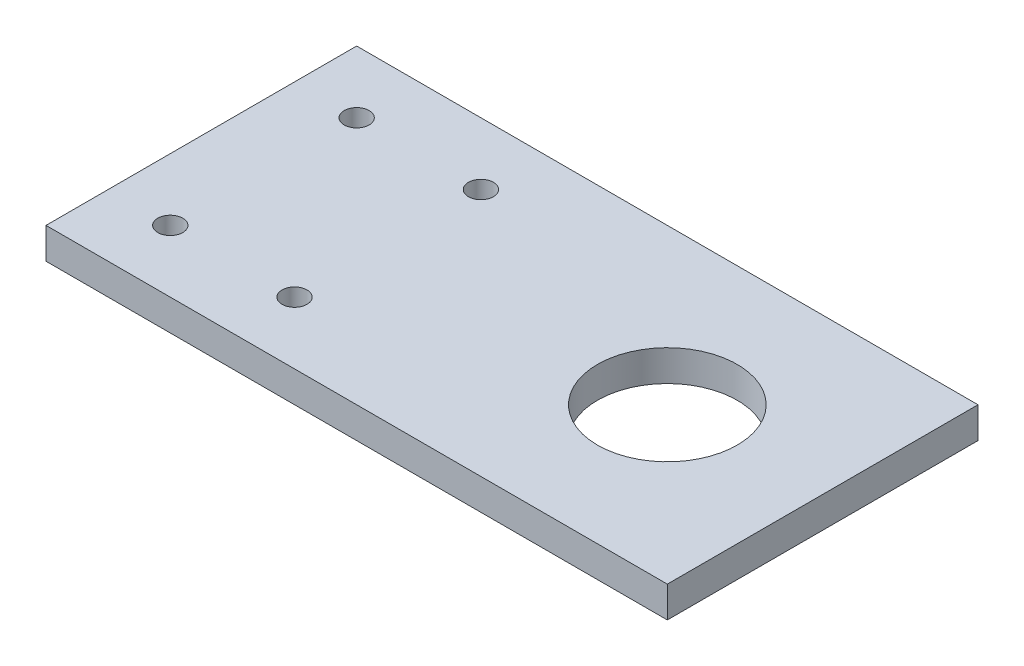
ISO-10303-21;
HEADER;
FILE_DESCRIPTION(('STEP AP214'),'2;1');
FILE_NAME('part.step','',(''),(''),'','','');
FILE_SCHEMA(('AUTOMOTIVE_DESIGN { 1 0 10303 214 1 1 1 1 }'));
ENDSEC;
DATA;
#1=APPLICATION_CONTEXT('core data for automotive mechanical design processes');
#2=APPLICATION_PROTOCOL_DEFINITION('international standard','automotive_design',2000,#1);
#3=PRODUCT_CONTEXT('',#1,'mechanical');
#4=PRODUCT('Part','Part','',(#3));
#5=PRODUCT_RELATED_PRODUCT_CATEGORY('part','',(#4));
#6=PRODUCT_DEFINITION_FORMATION('','',#4);
#7=PRODUCT_DEFINITION_CONTEXT('part definition',#1,'design');
#8=PRODUCT_DEFINITION('design','',#6,#7);
#9=PRODUCT_DEFINITION_SHAPE('','',#8);
#10=(LENGTH_UNIT() NAMED_UNIT(*) SI_UNIT(.MILLI.,.METRE.));
#11=(NAMED_UNIT(*) PLANE_ANGLE_UNIT() SI_UNIT($,.RADIAN.));
#12=(NAMED_UNIT(*) SI_UNIT($,.STERADIAN.) SOLID_ANGLE_UNIT());
#13=UNCERTAINTY_MEASURE_WITH_UNIT(LENGTH_MEASURE(1.E-05),#10,'distance_accuracy_value','');
#14=(GEOMETRIC_REPRESENTATION_CONTEXT(3) GLOBAL_UNCERTAINTY_ASSIGNED_CONTEXT((#13)) GLOBAL_UNIT_ASSIGNED_CONTEXT((#10,
#11,#12)) REPRESENTATION_CONTEXT('',''));
#15=CARTESIAN_POINT('',(0.,0.,0.));
#16=DIRECTION('',(0.,0.,1.));
#17=DIRECTION('',(1.,0.,0.));
#18=AXIS2_PLACEMENT_3D('',#15,#16,#17);
#19=CARTESIAN_POINT('',(-50.8,6.35,31.75));
#20=DIRECTION('',(1.,0.,0.));
#21=DIRECTION('',(0.,0.,-1.));
#22=AXIS2_PLACEMENT_3D('',#19,#20,#21);
#23=PLANE('',#22);
#24=DIRECTION('',(0.,0.,1.));
#25=VECTOR('',#24,1.);
#26=CARTESIAN_POINT('',(-50.8,0.,31.75));
#27=LINE('',#26,#25);
#28=CARTESIAN_POINT('',(-50.8,0.,-31.75));
#29=VERTEX_POINT('',#28);
#30=CARTESIAN_POINT('',(-50.8,0.,31.75));
#31=VERTEX_POINT('',#30);
#32=EDGE_CURVE('E99',#29,#31,#27,.T.);
#33=ORIENTED_EDGE('',*,*,#32,.T.);
#34=DIRECTION('',(0.,-1.,0.));
#35=VECTOR('',#34,1.);
#36=CARTESIAN_POINT('',(-50.8,6.35,31.75));
#37=LINE('',#36,#35);
#38=CARTESIAN_POINT('',(-50.8,6.35,31.75));
#39=VERTEX_POINT('',#38);
#40=EDGE_CURVE('E52',#39,#31,#37,.T.);
#41=ORIENTED_EDGE('',*,*,#40,.F.);
#42=DIRECTION('',(0.,0.,1.));
#43=VECTOR('',#42,1.);
#44=CARTESIAN_POINT('',(-50.8,6.35,31.75));
#45=LINE('',#44,#43);
#46=CARTESIAN_POINT('',(-50.8,6.35,-31.75));
#47=VERTEX_POINT('',#46);
#48=EDGE_CURVE('E90',#47,#39,#45,.T.);
#49=ORIENTED_EDGE('',*,*,#48,.F.);
#50=DIRECTION('',(0.,-1.,0.));
#51=VECTOR('',#50,1.);
#52=CARTESIAN_POINT('',(-50.8,6.35,-31.75));
#53=LINE('',#52,#51);
#54=EDGE_CURVE('E11',#47,#29,#53,.T.);
#55=ORIENTED_EDGE('',*,*,#54,.T.);
#56=EDGE_LOOP('',(#33,#41,#49,#55));
#57=FACE_BOUND('',#56,.T.);
#58=ADVANCED_FACE('F43',(#57),#23,.F.);
#59=CARTESIAN_POINT('',(76.2,6.35,31.75));
#60=DIRECTION('',(0.,0.,-1.));
#61=DIRECTION('',(-1.,0.,0.));
#62=AXIS2_PLACEMENT_3D('',#59,#60,#61);
#63=PLANE('',#62);
#64=DIRECTION('',(1.,0.,0.));
#65=VECTOR('',#64,1.);
#66=CARTESIAN_POINT('',(76.2,0.,31.75));
#67=LINE('',#66,#65);
#68=CARTESIAN_POINT('',(76.2,0.,31.75));
#69=VERTEX_POINT('',#68);
#70=EDGE_CURVE('E77',#31,#69,#67,.T.);
#71=ORIENTED_EDGE('',*,*,#70,.T.);
#72=DIRECTION('',(0.,-1.,0.));
#73=VECTOR('',#72,1.);
#74=CARTESIAN_POINT('',(76.2,6.35,31.75));
#75=LINE('',#74,#73);
#76=CARTESIAN_POINT('',(76.2,6.35,31.75));
#77=VERTEX_POINT('',#76);
#78=EDGE_CURVE('E101',#77,#69,#75,.T.);
#79=ORIENTED_EDGE('',*,*,#78,.F.);
#80=DIRECTION('',(1.,0.,0.));
#81=VECTOR('',#80,1.);
#82=CARTESIAN_POINT('',(-50.8,6.35,31.75));
#83=LINE('',#82,#81);
#84=EDGE_CURVE('E94',#39,#77,#83,.T.);
#85=ORIENTED_EDGE('',*,*,#84,.F.);
#86=ORIENTED_EDGE('',*,*,#40,.T.);
#87=EDGE_LOOP('',(#71,#79,#85,#86));
#88=FACE_BOUND('',#87,.T.);
#89=ADVANCED_FACE('F102',(#88),#63,.F.);
#90=CARTESIAN_POINT('',(76.2,6.35,-31.75));
#91=DIRECTION('',(-1.,0.,0.));
#92=DIRECTION('',(0.,0.,1.));
#93=AXIS2_PLACEMENT_3D('',#90,#91,#92);
#94=PLANE('',#93);
#95=DIRECTION('',(0.,0.,-1.));
#96=VECTOR('',#95,1.);
#97=CARTESIAN_POINT('',(76.2,0.,-31.75));
#98=LINE('',#97,#96);
#99=CARTESIAN_POINT('',(76.2,0.,-31.75));
#100=VERTEX_POINT('',#99);
#101=EDGE_CURVE('E84',#69,#100,#98,.T.);
#102=ORIENTED_EDGE('',*,*,#101,.T.);
#103=DIRECTION('',(0.,-1.,0.));
#104=VECTOR('',#103,1.);
#105=CARTESIAN_POINT('',(76.2,6.35,-31.75));
#106=LINE('',#105,#104);
#107=CARTESIAN_POINT('',(76.2,6.35,-31.75));
#108=VERTEX_POINT('',#107);
#109=EDGE_CURVE('E108',#108,#100,#106,.T.);
#110=ORIENTED_EDGE('',*,*,#109,.F.);
#111=DIRECTION('',(0.,0.,-1.));
#112=VECTOR('',#111,1.);
#113=CARTESIAN_POINT('',(76.2,6.35,-31.75));
#114=LINE('',#113,#112);
#115=EDGE_CURVE('E105',#77,#108,#114,.T.);
#116=ORIENTED_EDGE('',*,*,#115,.F.);
#117=ORIENTED_EDGE('',*,*,#78,.T.);
#118=EDGE_LOOP('',(#102,#110,#116,#117));
#119=FACE_BOUND('',#118,.T.);
#120=ADVANCED_FACE('F125',(#119),#94,.F.);
#121=CARTESIAN_POINT('',(50.8,6.35,-31.75));
#122=DIRECTION('',(0.,0.,1.));
#123=DIRECTION('',(1.,0.,0.));
#124=AXIS2_PLACEMENT_3D('',#121,#122,#123);
#125=PLANE('',#124);
#126=DIRECTION('',(-1.,0.,0.));
#127=VECTOR('',#126,1.);
#128=CARTESIAN_POINT('',(50.8,0.,-31.75));
#129=LINE('',#128,#127);
#130=EDGE_CURVE('E119',#100,#29,#129,.T.);
#131=ORIENTED_EDGE('',*,*,#130,.T.);
#132=ORIENTED_EDGE('',*,*,#54,.F.);
#133=DIRECTION('',(-1.,0.,0.));
#134=VECTOR('',#133,1.);
#135=CARTESIAN_POINT('',(-50.8,6.35,-31.75));
#136=LINE('',#135,#134);
#137=EDGE_CURVE('E60',#108,#47,#136,.T.);
#138=ORIENTED_EDGE('',*,*,#137,.F.);
#139=ORIENTED_EDGE('',*,*,#109,.T.);
#140=EDGE_LOOP('',(#131,#132,#138,#139));
#141=FACE_BOUND('',#140,.T.);
#142=ADVANCED_FACE('F129',(#141),#125,.F.);
#143=CARTESIAN_POINT('',(0.,6.35,0.));
#144=DIRECTION('',(0.,-1.,0.));
#145=DIRECTION('',(0.,0.,-1.));
#146=AXIS2_PLACEMENT_3D('',#143,#144,#145);
#147=PLANE('',#146);
#148=CARTESIAN_POINT('',(44.45,6.35,0.));
#149=DIRECTION('',(0.,1.,0.));
#150=DIRECTION('',(0.,0.,1.));
#151=AXIS2_PLACEMENT_3D('',#148,#149,#150);
#152=CIRCLE('',#151,14.2875);
#153=CARTESIAN_POINT('',(44.45,6.35,14.2875));
#154=VERTEX_POINT('',#153);
#155=EDGE_CURVE('E262',#154,#154,#152,.T.);
#156=ORIENTED_EDGE('',*,*,#155,.F.);
#157=EDGE_LOOP('',(#156));
#158=FACE_BOUND('',#157,.T.);
#159=CARTESIAN_POINT('',(-38.1,6.35,-19.05));
#160=DIRECTION('',(0.,1.,0.));
#161=DIRECTION('',(0.,0.,1.));
#162=AXIS2_PLACEMENT_3D('',#159,#160,#161);
#163=CIRCLE('',#162,2.55269999999999);
#164=CARTESIAN_POINT('',(-38.1,6.35,-16.4973));
#165=VERTEX_POINT('',#164);
#166=EDGE_CURVE('E266',#165,#165,#163,.T.);
#167=ORIENTED_EDGE('',*,*,#166,.F.);
#168=EDGE_LOOP('',(#167));
#169=FACE_BOUND('',#168,.T.);
#170=CARTESIAN_POINT('',(-12.7,6.35,-19.05));
#171=DIRECTION('',(0.,1.,0.));
#172=DIRECTION('',(0.,0.,1.));
#173=AXIS2_PLACEMENT_3D('',#170,#171,#172);
#174=CIRCLE('',#173,2.55269999999999);
#175=CARTESIAN_POINT('',(-12.7,6.35,-16.4973));
#176=VERTEX_POINT('',#175);
#177=EDGE_CURVE('E276',#176,#176,#174,.T.);
#178=ORIENTED_EDGE('',*,*,#177,.F.);
#179=EDGE_LOOP('',(#178));
#180=FACE_BOUND('',#179,.T.);
#181=CARTESIAN_POINT('',(-12.7,6.35,19.05));
#182=DIRECTION('',(0.,1.,0.));
#183=DIRECTION('',(0.,0.,1.));
#184=AXIS2_PLACEMENT_3D('',#181,#182,#183);
#185=CIRCLE('',#184,2.55269999999999);
#186=CARTESIAN_POINT('',(-12.7,6.35,21.6027));
#187=VERTEX_POINT('',#186);
#188=EDGE_CURVE('E284',#187,#187,#185,.T.);
#189=ORIENTED_EDGE('',*,*,#188,.F.);
#190=EDGE_LOOP('',(#189));
#191=FACE_BOUND('',#190,.T.);
#192=CARTESIAN_POINT('',(-38.1,6.35,19.05));
#193=DIRECTION('',(0.,1.,0.));
#194=DIRECTION('',(0.,0.,1.));
#195=AXIS2_PLACEMENT_3D('',#192,#193,#194);
#196=CIRCLE('',#195,2.55269999999999);
#197=CARTESIAN_POINT('',(-38.1,6.35,21.6027));
#198=VERTEX_POINT('',#197);
#199=EDGE_CURVE('E292',#198,#198,#196,.T.);
#200=ORIENTED_EDGE('',*,*,#199,.F.);
#201=EDGE_LOOP('',(#200));
#202=FACE_BOUND('',#201,.T.);
#203=ORIENTED_EDGE('',*,*,#137,.T.);
#204=ORIENTED_EDGE('',*,*,#48,.T.);
#205=ORIENTED_EDGE('',*,*,#84,.T.);
#206=ORIENTED_EDGE('',*,*,#115,.T.);
#207=EDGE_LOOP('',(#203,#204,#205,#206));
#208=FACE_BOUND('',#207,.T.);
#209=ADVANCED_FACE('F92',(#158,#169,#180,#191,#202,#208),#147,.F.);
#210=CARTESIAN_POINT('',(0.,0.,0.));
#211=DIRECTION('',(0.,-1.,0.));
#212=DIRECTION('',(0.,0.,-1.));
#213=AXIS2_PLACEMENT_3D('',#210,#211,#212);
#214=PLANE('',#213);
#215=CARTESIAN_POINT('',(44.45,0.,0.));
#216=DIRECTION('',(0.,1.,0.));
#217=DIRECTION('',(0.,0.,1.));
#218=AXIS2_PLACEMENT_3D('',#215,#216,#217);
#219=CIRCLE('',#218,14.2875);
#220=CARTESIAN_POINT('',(44.45,0.,14.2875));
#221=VERTEX_POINT('',#220);
#222=EDGE_CURVE('E259',#221,#221,#219,.T.);
#223=ORIENTED_EDGE('',*,*,#222,.T.);
#224=EDGE_LOOP('',(#223));
#225=FACE_BOUND('',#224,.T.);
#226=CARTESIAN_POINT('',(-38.1,0.,-19.05));
#227=DIRECTION('',(0.,1.,0.));
#228=DIRECTION('',(0.,0.,1.));
#229=AXIS2_PLACEMENT_3D('',#226,#227,#228);
#230=CIRCLE('',#229,2.5527);
#231=CARTESIAN_POINT('',(-38.1,0.,-16.4973));
#232=VERTEX_POINT('',#231);
#233=EDGE_CURVE('E272',#232,#232,#230,.T.);
#234=ORIENTED_EDGE('',*,*,#233,.T.);
#235=EDGE_LOOP('',(#234));
#236=FACE_BOUND('',#235,.T.);
#237=CARTESIAN_POINT('',(-12.7,0.,-19.05));
#238=DIRECTION('',(0.,1.,0.));
#239=DIRECTION('',(0.,0.,1.));
#240=AXIS2_PLACEMENT_3D('',#237,#238,#239);
#241=CIRCLE('',#240,2.5527);
#242=CARTESIAN_POINT('',(-12.7,0.,-16.4973));
#243=VERTEX_POINT('',#242);
#244=EDGE_CURVE('E280',#243,#243,#241,.T.);
#245=ORIENTED_EDGE('',*,*,#244,.T.);
#246=EDGE_LOOP('',(#245));
#247=FACE_BOUND('',#246,.T.);
#248=CARTESIAN_POINT('',(-12.7,0.,19.05));
#249=DIRECTION('',(0.,1.,0.));
#250=DIRECTION('',(0.,0.,1.));
#251=AXIS2_PLACEMENT_3D('',#248,#249,#250);
#252=CIRCLE('',#251,2.5527);
#253=CARTESIAN_POINT('',(-12.7,0.,21.6027));
#254=VERTEX_POINT('',#253);
#255=EDGE_CURVE('E288',#254,#254,#252,.T.);
#256=ORIENTED_EDGE('',*,*,#255,.T.);
#257=EDGE_LOOP('',(#256));
#258=FACE_BOUND('',#257,.T.);
#259=CARTESIAN_POINT('',(-38.1,0.,19.05));
#260=DIRECTION('',(0.,1.,0.));
#261=DIRECTION('',(0.,0.,1.));
#262=AXIS2_PLACEMENT_3D('',#259,#260,#261);
#263=CIRCLE('',#262,2.5527);
#264=CARTESIAN_POINT('',(-38.1,0.,21.6027));
#265=VERTEX_POINT('',#264);
#266=EDGE_CURVE('E114',#265,#265,#263,.T.);
#267=ORIENTED_EDGE('',*,*,#266,.T.);
#268=EDGE_LOOP('',(#267));
#269=FACE_BOUND('',#268,.T.);
#270=ORIENTED_EDGE('',*,*,#32,.F.);
#271=ORIENTED_EDGE('',*,*,#130,.F.);
#272=ORIENTED_EDGE('',*,*,#101,.F.);
#273=ORIENTED_EDGE('',*,*,#70,.F.);
#274=EDGE_LOOP('',(#270,#271,#272,#273));
#275=FACE_BOUND('',#274,.T.);
#276=ADVANCED_FACE('F128',(#225,#236,#247,#258,#269,#275),#214,.T.);
#277=CARTESIAN_POINT('',(-38.1,6.35,19.05));
#278=DIRECTION('',(0.,1.,0.));
#279=DIRECTION('',(0.,0.,1.));
#280=AXIS2_PLACEMENT_3D('',#277,#278,#279);
#281=CYLINDRICAL_SURFACE('',#280,2.55269999999999);
#282=ORIENTED_EDGE('',*,*,#266,.F.);
#283=EDGE_LOOP('',(#282));
#284=FACE_BOUND('',#283,.T.);
#285=ORIENTED_EDGE('',*,*,#199,.T.);
#286=EDGE_LOOP('',(#285));
#287=FACE_BOUND('',#286,.T.);
#288=ADVANCED_FACE('F162',(#284,#287),#281,.F.);
#289=CARTESIAN_POINT('',(-12.7,6.35,19.05));
#290=DIRECTION('',(0.,1.,0.));
#291=DIRECTION('',(0.,0.,1.));
#292=AXIS2_PLACEMENT_3D('',#289,#290,#291);
#293=CYLINDRICAL_SURFACE('',#292,2.55269999999999);
#294=ORIENTED_EDGE('',*,*,#255,.F.);
#295=EDGE_LOOP('',(#294));
#296=FACE_BOUND('',#295,.T.);
#297=ORIENTED_EDGE('',*,*,#188,.T.);
#298=EDGE_LOOP('',(#297));
#299=FACE_BOUND('',#298,.T.);
#300=ADVANCED_FACE('F167',(#296,#299),#293,.F.);
#301=CARTESIAN_POINT('',(-12.7,6.35,-19.05));
#302=DIRECTION('',(0.,1.,0.));
#303=DIRECTION('',(0.,0.,1.));
#304=AXIS2_PLACEMENT_3D('',#301,#302,#303);
#305=CYLINDRICAL_SURFACE('',#304,2.55269999999999);
#306=ORIENTED_EDGE('',*,*,#244,.F.);
#307=EDGE_LOOP('',(#306));
#308=FACE_BOUND('',#307,.T.);
#309=ORIENTED_EDGE('',*,*,#177,.T.);
#310=EDGE_LOOP('',(#309));
#311=FACE_BOUND('',#310,.T.);
#312=ADVANCED_FACE('F180',(#308,#311),#305,.F.);
#313=CARTESIAN_POINT('',(-38.1,6.35,-19.05));
#314=DIRECTION('',(0.,1.,0.));
#315=DIRECTION('',(0.,0.,1.));
#316=AXIS2_PLACEMENT_3D('',#313,#314,#315);
#317=CYLINDRICAL_SURFACE('',#316,2.55269999999999);
#318=ORIENTED_EDGE('',*,*,#233,.F.);
#319=EDGE_LOOP('',(#318));
#320=FACE_BOUND('',#319,.T.);
#321=ORIENTED_EDGE('',*,*,#166,.T.);
#322=EDGE_LOOP('',(#321));
#323=FACE_BOUND('',#322,.T.);
#324=ADVANCED_FACE('F191',(#320,#323),#317,.F.);
#325=CARTESIAN_POINT('',(44.45,0.,0.));
#326=DIRECTION('',(0.,1.,0.));
#327=DIRECTION('',(0.,0.,1.));
#328=AXIS2_PLACEMENT_3D('',#325,#326,#327);
#329=CYLINDRICAL_SURFACE('',#328,14.2875);
#330=ORIENTED_EDGE('',*,*,#222,.F.);
#331=EDGE_LOOP('',(#330));
#332=FACE_BOUND('',#331,.T.);
#333=ORIENTED_EDGE('',*,*,#155,.T.);
#334=EDGE_LOOP('',(#333));
#335=FACE_BOUND('',#334,.T.);
#336=ADVANCED_FACE('F202',(#332,#335),#329,.F.);
#337=CLOSED_SHELL('',(#58,#89,#120,#142,#209,#276,#288,#300,#312,#324,#336));
#338=MANIFOLD_SOLID_BREP('B2',#337);
#339=ADVANCED_BREP_SHAPE_REPRESENTATION('',(#18,#338),#14);
#340=SHAPE_DEFINITION_REPRESENTATION(#9,#339);
ENDSEC;
END-ISO-10303-21;
